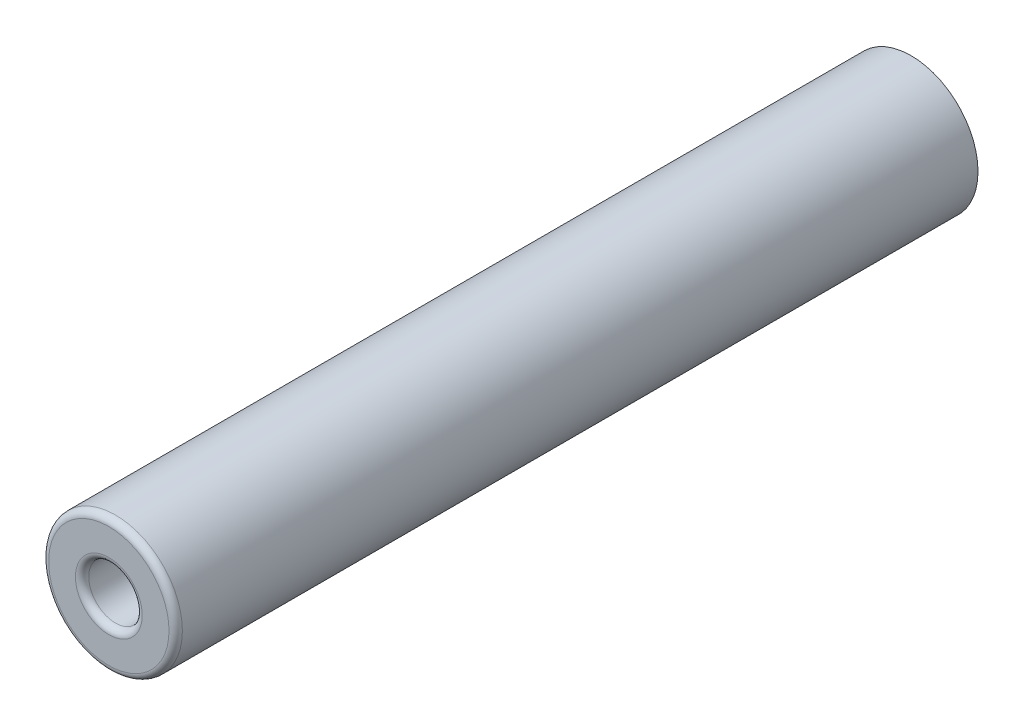
ISO-10303-21;
HEADER;
FILE_DESCRIPTION(('STEP AP214'),'2;1');
FILE_NAME('part.step','',(''),(''),'','','');
FILE_SCHEMA(('AUTOMOTIVE_DESIGN { 1 0 10303 214 1 1 1 1 }'));
ENDSEC;
DATA;
#1=APPLICATION_CONTEXT('core data for automotive mechanical design processes');
#2=APPLICATION_PROTOCOL_DEFINITION('international standard','automotive_design',2000,#1);
#3=PRODUCT_CONTEXT('',#1,'mechanical');
#4=PRODUCT('Part','Part','',(#3));
#5=PRODUCT_RELATED_PRODUCT_CATEGORY('part','',(#4));
#6=PRODUCT_DEFINITION_FORMATION('','',#4);
#7=PRODUCT_DEFINITION_CONTEXT('part definition',#1,'design');
#8=PRODUCT_DEFINITION('design','',#6,#7);
#9=PRODUCT_DEFINITION_SHAPE('','',#8);
#10=(LENGTH_UNIT() NAMED_UNIT(*) SI_UNIT(.MILLI.,.METRE.));
#11=(NAMED_UNIT(*) PLANE_ANGLE_UNIT() SI_UNIT($,.RADIAN.));
#12=(NAMED_UNIT(*) SI_UNIT($,.STERADIAN.) SOLID_ANGLE_UNIT());
#13=UNCERTAINTY_MEASURE_WITH_UNIT(LENGTH_MEASURE(1.E-05),#10,'distance_accuracy_value','');
#14=(GEOMETRIC_REPRESENTATION_CONTEXT(3) GLOBAL_UNCERTAINTY_ASSIGNED_CONTEXT((#13)) GLOBAL_UNIT_ASSIGNED_CONTEXT((#10,
#11,#12)) REPRESENTATION_CONTEXT('',''));
#15=CARTESIAN_POINT('',(0.,0.,0.));
#16=DIRECTION('',(0.,0.,1.));
#17=DIRECTION('',(1.,0.,0.));
#18=AXIS2_PLACEMENT_3D('',#15,#16,#17);
#19=CARTESIAN_POINT('',(0.,0.,30.));
#20=DIRECTION('',(0.,0.,-1.));
#21=DIRECTION('',(-1.,0.,0.));
#22=AXIS2_PLACEMENT_3D('',#19,#20,#21);
#23=CYLINDRICAL_SURFACE('',#22,2.5);
#24=CARTESIAN_POINT('',(0.,0.,29.75));
#25=DIRECTION('',(0.,0.,1.));
#26=DIRECTION('',(1.,0.,0.));
#27=AXIS2_PLACEMENT_3D('',#24,#25,#26);
#28=CIRCLE('',#27,2.5);
#29=CARTESIAN_POINT('',(2.5,0.,29.75));
#30=VERTEX_POINT('',#29);
#31=EDGE_CURVE('E37',#30,#30,#28,.F.);
#32=ORIENTED_EDGE('',*,*,#31,.T.);
#33=EDGE_LOOP('',(#32));
#34=FACE_BOUND('',#33,.T.);
#35=CARTESIAN_POINT('',(0.,0.,0.));
#36=DIRECTION('',(0.,0.,1.));
#37=DIRECTION('',(1.,0.,0.));
#38=AXIS2_PLACEMENT_3D('',#35,#36,#37);
#39=CIRCLE('',#38,2.5);
#40=CARTESIAN_POINT('',(2.5,0.,0.));
#41=VERTEX_POINT('',#40);
#42=EDGE_CURVE('E50',#41,#41,#39,.T.);
#43=ORIENTED_EDGE('',*,*,#42,.T.);
#44=EDGE_LOOP('',(#43));
#45=FACE_BOUND('',#44,.T.);
#46=ADVANCED_FACE('F30',(#34,#45),#23,.T.);
#47=CARTESIAN_POINT('',(0.,0.,30.));
#48=DIRECTION('',(0.,0.,1.));
#49=DIRECTION('',(1.,0.,0.));
#50=AXIS2_PLACEMENT_3D('',#47,#48,#49);
#51=PLANE('',#50);
#52=CARTESIAN_POINT('',(0.,0.,30.));
#53=DIRECTION('',(0.,0.,1.));
#54=DIRECTION('',(1.,0.,0.));
#55=AXIS2_PLACEMENT_3D('',#52,#53,#54);
#56=CIRCLE('',#55,2.25);
#57=CARTESIAN_POINT('',(2.25,0.,30.));
#58=VERTEX_POINT('',#57);
#59=EDGE_CURVE('E41',#58,#58,#56,.T.);
#60=ORIENTED_EDGE('',*,*,#59,.T.);
#61=EDGE_LOOP('',(#60));
#62=FACE_BOUND('',#61,.T.);
#63=CARTESIAN_POINT('',(0.,0.,30.));
#64=DIRECTION('',(0.,0.,1.));
#65=DIRECTION('',(1.,0.,0.));
#66=AXIS2_PLACEMENT_3D('',#63,#64,#65);
#67=CIRCLE('',#66,1.25);
#68=CARTESIAN_POINT('',(1.25,0.,30.));
#69=VERTEX_POINT('',#68);
#70=EDGE_CURVE('E45',#69,#69,#67,.F.);
#71=ORIENTED_EDGE('',*,*,#70,.T.);
#72=EDGE_LOOP('',(#71));
#73=FACE_BOUND('',#72,.T.);
#74=ADVANCED_FACE('F69',(#62,#73),#51,.T.);
#75=CARTESIAN_POINT('',(0.,0.,0.));
#76=DIRECTION('',(0.,0.,1.));
#77=DIRECTION('',(1.,0.,0.));
#78=AXIS2_PLACEMENT_3D('',#75,#76,#77);
#79=PLANE('',#78);
#80=ORIENTED_EDGE('',*,*,#42,.F.);
#81=EDGE_LOOP('',(#80));
#82=FACE_BOUND('',#81,.T.);
#83=ADVANCED_FACE('F61',(#82),#79,.F.);
#84=CARTESIAN_POINT('',(0.,0.,20.));
#85=DIRECTION('',(0.,0.,1.));
#86=DIRECTION('',(1.,0.,0.));
#87=AXIS2_PLACEMENT_3D('',#84,#85,#86);
#88=CYLINDRICAL_SURFACE('',#87,1.);
#89=CARTESIAN_POINT('',(0.,0.,29.75));
#90=DIRECTION('',(0.,0.,1.));
#91=DIRECTION('',(1.,0.,0.));
#92=AXIS2_PLACEMENT_3D('',#89,#90,#91);
#93=CIRCLE('',#92,1.);
#94=CARTESIAN_POINT('',(1.,0.,29.75));
#95=VERTEX_POINT('',#94);
#96=EDGE_CURVE('E10',#95,#95,#93,.T.);
#97=ORIENTED_EDGE('',*,*,#96,.T.);
#98=EDGE_LOOP('',(#97));
#99=FACE_BOUND('',#98,.T.);
#100=CARTESIAN_POINT('',(0.,0.,20.));
#101=DIRECTION('',(0.,0.,1.));
#102=DIRECTION('',(1.,0.,0.));
#103=AXIS2_PLACEMENT_3D('',#100,#101,#102);
#104=CIRCLE('',#103,1.);
#105=CARTESIAN_POINT('',(1.,0.,20.));
#106=VERTEX_POINT('',#105);
#107=EDGE_CURVE('E53',#106,#106,#104,.T.);
#108=ORIENTED_EDGE('',*,*,#107,.F.);
#109=EDGE_LOOP('',(#108));
#110=FACE_BOUND('',#109,.T.);
#111=ADVANCED_FACE('F59',(#99,#110),#88,.F.);
#112=CARTESIAN_POINT('',(0.,0.,20.));
#113=DIRECTION('',(0.,0.,1.));
#114=DIRECTION('',(1.,0.,0.));
#115=AXIS2_PLACEMENT_3D('',#112,#113,#114);
#116=PLANE('',#115);
#117=ORIENTED_EDGE('',*,*,#107,.T.);
#118=EDGE_LOOP('',(#117));
#119=FACE_BOUND('',#118,.T.);
#120=ADVANCED_FACE('F57',(#119),#116,.T.);
#121=CARTESIAN_POINT('',(0.,0.,29.75));
#122=DIRECTION('',(0.,0.,1.));
#123=DIRECTION('',(1.,0.,0.));
#124=AXIS2_PLACEMENT_3D('',#121,#122,#123);
#125=TOROIDAL_SURFACE('',#124,2.25,0.25);
#126=ORIENTED_EDGE('',*,*,#31,.F.);
#127=EDGE_LOOP('',(#126));
#128=FACE_BOUND('',#127,.T.);
#129=ORIENTED_EDGE('',*,*,#59,.F.);
#130=EDGE_LOOP('',(#129));
#131=FACE_BOUND('',#130,.T.);
#132=ADVANCED_FACE('F67',(#128,#131),#125,.T.);
#133=CARTESIAN_POINT('',(0.,0.,29.75));
#134=DIRECTION('',(0.,0.,1.));
#135=DIRECTION('',(1.,0.,0.));
#136=AXIS2_PLACEMENT_3D('',#133,#134,#135);
#137=TOROIDAL_SURFACE('',#136,1.25,0.25);
#138=ORIENTED_EDGE('',*,*,#70,.F.);
#139=EDGE_LOOP('',(#138));
#140=FACE_BOUND('',#139,.T.);
#141=ORIENTED_EDGE('',*,*,#96,.F.);
#142=EDGE_LOOP('',(#141));
#143=FACE_BOUND('',#142,.T.);
#144=ADVANCED_FACE('F32',(#140,#143),#137,.T.);
#145=CLOSED_SHELL('',(#46,#74,#83,#111,#120,#132,#144));
#146=MANIFOLD_SOLID_BREP('B2',#145);
#147=ADVANCED_BREP_SHAPE_REPRESENTATION('',(#18,#146),#14);
#148=SHAPE_DEFINITION_REPRESENTATION(#9,#147);
ENDSEC;
END-ISO-10303-21;
